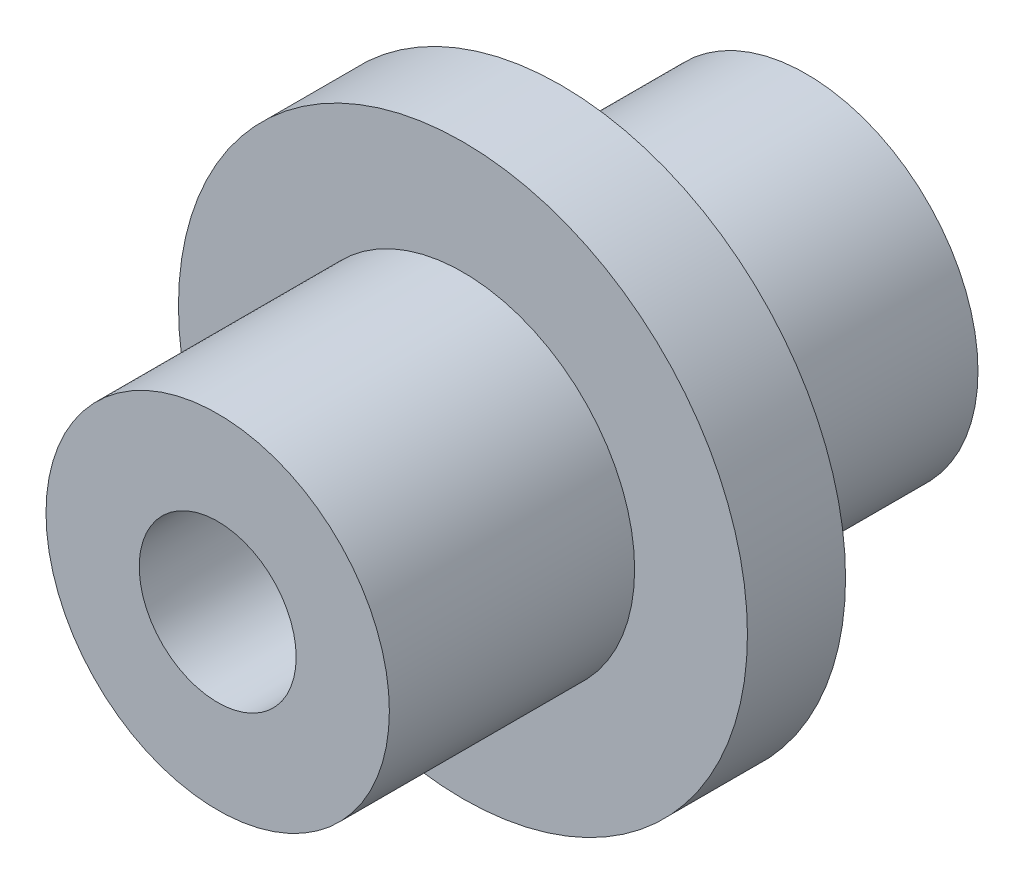
ISO-10303-21;
HEADER;
FILE_DESCRIPTION(('STEP AP214'),'2;1');
FILE_NAME('part.step','',(''),(''),'','','');
FILE_SCHEMA(('AUTOMOTIVE_DESIGN { 1 0 10303 214 1 1 1 1 }'));
ENDSEC;
DATA;
#1=APPLICATION_CONTEXT('core data for automotive mechanical design processes');
#2=APPLICATION_PROTOCOL_DEFINITION('international standard','automotive_design',2000,#1);
#3=PRODUCT_CONTEXT('',#1,'mechanical');
#4=PRODUCT('Part','Part','',(#3));
#5=PRODUCT_RELATED_PRODUCT_CATEGORY('part','',(#4));
#6=PRODUCT_DEFINITION_FORMATION('','',#4);
#7=PRODUCT_DEFINITION_CONTEXT('part definition',#1,'design');
#8=PRODUCT_DEFINITION('design','',#6,#7);
#9=PRODUCT_DEFINITION_SHAPE('','',#8);
#10=(LENGTH_UNIT() NAMED_UNIT(*) SI_UNIT(.MILLI.,.METRE.));
#11=(NAMED_UNIT(*) PLANE_ANGLE_UNIT() SI_UNIT($,.RADIAN.));
#12=(NAMED_UNIT(*) SI_UNIT($,.STERADIAN.) SOLID_ANGLE_UNIT());
#13=UNCERTAINTY_MEASURE_WITH_UNIT(LENGTH_MEASURE(1.E-05),#10,'distance_accuracy_value','');
#14=(GEOMETRIC_REPRESENTATION_CONTEXT(3) GLOBAL_UNCERTAINTY_ASSIGNED_CONTEXT((#13)) GLOBAL_UNIT_ASSIGNED_CONTEXT((#10,
#11,#12)) REPRESENTATION_CONTEXT('',''));
#15=CARTESIAN_POINT('',(0.,0.,0.));
#16=DIRECTION('',(0.,0.,1.));
#17=DIRECTION('',(1.,0.,0.));
#18=AXIS2_PLACEMENT_3D('',#15,#16,#17);
#19=CARTESIAN_POINT('',(0.,0.,31.));
#20=DIRECTION('',(0.,0.,1.));
#21=DIRECTION('',(1.,0.,0.));
#22=AXIS2_PLACEMENT_3D('',#19,#20,#21);
#23=CYLINDRICAL_SURFACE('',#22,5.8);
#24=CARTESIAN_POINT('',(0.,0.,31.));
#25=DIRECTION('',(0.,0.,1.));
#26=DIRECTION('',(1.,0.,0.));
#27=AXIS2_PLACEMENT_3D('',#24,#25,#26);
#28=CIRCLE('',#27,5.8);
#29=CARTESIAN_POINT('',(5.8,0.,31.));
#30=VERTEX_POINT('',#29);
#31=EDGE_CURVE('E44',#30,#30,#28,.T.);
#32=ORIENTED_EDGE('',*,*,#31,.T.);
#33=EDGE_LOOP('',(#32));
#34=FACE_BOUND('',#33,.T.);
#35=CARTESIAN_POINT('',(0.,0.,33.));
#36=DIRECTION('',(0.,0.,1.));
#37=DIRECTION('',(1.,0.,0.));
#38=AXIS2_PLACEMENT_3D('',#35,#36,#37);
#39=CIRCLE('',#38,5.8);
#40=CARTESIAN_POINT('',(5.8,0.,33.));
#41=VERTEX_POINT('',#40);
#42=EDGE_CURVE('E47',#41,#41,#39,.T.);
#43=ORIENTED_EDGE('',*,*,#42,.F.);
#44=EDGE_LOOP('',(#43));
#45=FACE_BOUND('',#44,.T.);
#46=ADVANCED_FACE('F39',(#34,#45),#23,.T.);
#47=CARTESIAN_POINT('',(0.,0.,31.));
#48=DIRECTION('',(0.,0.,1.));
#49=DIRECTION('',(1.,0.,0.));
#50=AXIS2_PLACEMENT_3D('',#47,#48,#49);
#51=PLANE('',#50);
#52=CARTESIAN_POINT('',(0.,0.,31.));
#53=DIRECTION('',(0.,0.,1.));
#54=DIRECTION('',(1.,0.,0.));
#55=AXIS2_PLACEMENT_3D('',#52,#53,#54);
#56=CIRCLE('',#55,3.5);
#57=CARTESIAN_POINT('',(3.5,0.,31.));
#58=VERTEX_POINT('',#57);
#59=EDGE_CURVE('E53',#58,#58,#56,.T.);
#60=ORIENTED_EDGE('',*,*,#59,.T.);
#61=EDGE_LOOP('',(#60));
#62=FACE_BOUND('',#61,.T.);
#63=ORIENTED_EDGE('',*,*,#31,.F.);
#64=EDGE_LOOP('',(#63));
#65=FACE_BOUND('',#64,.T.);
#66=ADVANCED_FACE('F95',(#62,#65),#51,.F.);
#67=CARTESIAN_POINT('',(0.,0.,33.));
#68=DIRECTION('',(0.,0.,1.));
#69=DIRECTION('',(1.,0.,0.));
#70=AXIS2_PLACEMENT_3D('',#67,#68,#69);
#71=PLANE('',#70);
#72=CARTESIAN_POINT('',(0.,0.,33.));
#73=DIRECTION('',(0.,0.,1.));
#74=DIRECTION('',(1.,0.,0.));
#75=AXIS2_PLACEMENT_3D('',#72,#73,#74);
#76=CIRCLE('',#75,3.5);
#77=CARTESIAN_POINT('',(3.5,0.,33.));
#78=VERTEX_POINT('',#77);
#79=EDGE_CURVE('E11',#78,#78,#76,.T.);
#80=ORIENTED_EDGE('',*,*,#79,.F.);
#81=EDGE_LOOP('',(#80));
#82=FACE_BOUND('',#81,.T.);
#83=ORIENTED_EDGE('',*,*,#42,.T.);
#84=EDGE_LOOP('',(#83));
#85=FACE_BOUND('',#84,.T.);
#86=ADVANCED_FACE('F76',(#82,#85),#71,.T.);
#87=CARTESIAN_POINT('',(0.,0.,38.));
#88=DIRECTION('',(0.,0.,1.));
#89=DIRECTION('',(1.,0.,0.));
#90=AXIS2_PLACEMENT_3D('',#87,#88,#89);
#91=PLANE('',#90);
#92=CARTESIAN_POINT('',(0.,0.,38.));
#93=DIRECTION('',(0.,0.,1.));
#94=DIRECTION('',(1.,0.,0.));
#95=AXIS2_PLACEMENT_3D('',#92,#93,#94);
#96=CIRCLE('',#95,1.6);
#97=CARTESIAN_POINT('',(1.6,0.,38.));
#98=VERTEX_POINT('',#97);
#99=EDGE_CURVE('E70',#98,#98,#96,.T.);
#100=ORIENTED_EDGE('',*,*,#99,.F.);
#101=EDGE_LOOP('',(#100));
#102=FACE_BOUND('',#101,.T.);
#103=CARTESIAN_POINT('',(0.,0.,38.));
#104=DIRECTION('',(0.,0.,1.));
#105=DIRECTION('',(1.,0.,0.));
#106=AXIS2_PLACEMENT_3D('',#103,#104,#105);
#107=CIRCLE('',#106,3.5);
#108=CARTESIAN_POINT('',(3.5,0.,38.));
#109=VERTEX_POINT('',#108);
#110=EDGE_CURVE('E64',#109,#109,#107,.T.);
#111=ORIENTED_EDGE('',*,*,#110,.T.);
#112=EDGE_LOOP('',(#111));
#113=FACE_BOUND('',#112,.T.);
#114=ADVANCED_FACE('F75',(#102,#113),#91,.T.);
#115=CARTESIAN_POINT('',(0.,0.,26.));
#116=DIRECTION('',(0.,0.,1.));
#117=DIRECTION('',(1.,0.,0.));
#118=AXIS2_PLACEMENT_3D('',#115,#116,#117);
#119=CYLINDRICAL_SURFACE('',#118,3.5);
#120=ORIENTED_EDGE('',*,*,#79,.T.);
#121=EDGE_LOOP('',(#120));
#122=FACE_BOUND('',#121,.T.);
#123=ORIENTED_EDGE('',*,*,#110,.F.);
#124=EDGE_LOOP('',(#123));
#125=FACE_BOUND('',#124,.T.);
#126=ADVANCED_FACE('F80',(#122,#125),#119,.T.);
#127=CARTESIAN_POINT('',(0.,0.,26.));
#128=DIRECTION('',(0.,0.,1.));
#129=DIRECTION('',(1.,0.,0.));
#130=AXIS2_PLACEMENT_3D('',#127,#128,#129);
#131=CIRCLE('',#130,3.5);
#132=CARTESIAN_POINT('',(3.5,0.,26.));
#133=VERTEX_POINT('',#132);
#134=EDGE_CURVE('E59',#133,#133,#131,.T.);
#135=ORIENTED_EDGE('',*,*,#134,.T.);
#136=EDGE_LOOP('',(#135));
#137=FACE_BOUND('',#136,.T.);
#138=ORIENTED_EDGE('',*,*,#59,.F.);
#139=EDGE_LOOP('',(#138));
#140=FACE_BOUND('',#139,.T.);
#141=ADVANCED_FACE('F85',(#137,#140),#119,.T.);
#142=CARTESIAN_POINT('',(0.,0.,26.));
#143=DIRECTION('',(0.,0.,1.));
#144=DIRECTION('',(1.,0.,0.));
#145=AXIS2_PLACEMENT_3D('',#142,#143,#144);
#146=PLANE('',#145);
#147=CARTESIAN_POINT('',(0.,0.,26.));
#148=DIRECTION('',(0.,0.,1.));
#149=DIRECTION('',(1.,0.,0.));
#150=AXIS2_PLACEMENT_3D('',#147,#148,#149);
#151=CIRCLE('',#150,1.65);
#152=CARTESIAN_POINT('',(1.65,0.,26.));
#153=VERTEX_POINT('',#152);
#154=EDGE_CURVE('E63',#153,#153,#151,.T.);
#155=ORIENTED_EDGE('',*,*,#154,.T.);
#156=EDGE_LOOP('',(#155));
#157=FACE_BOUND('',#156,.T.);
#158=ORIENTED_EDGE('',*,*,#134,.F.);
#159=EDGE_LOOP('',(#158));
#160=FACE_BOUND('',#159,.T.);
#161=ADVANCED_FACE('F89',(#157,#160),#146,.F.);
#162=CARTESIAN_POINT('',(0.,0.,38.));
#163=DIRECTION('',(0.,0.,-1.));
#164=DIRECTION('',(-1.,0.,0.));
#165=AXIS2_PLACEMENT_3D('',#162,#163,#164);
#166=CONICAL_SURFACE('',#165,1.6,0.00416664255426353);
#167=ORIENTED_EDGE('',*,*,#99,.T.);
#168=EDGE_LOOP('',(#167));
#169=FACE_BOUND('',#168,.T.);
#170=ORIENTED_EDGE('',*,*,#154,.F.);
#171=EDGE_LOOP('',(#170));
#172=FACE_BOUND('',#171,.T.);
#173=ADVANCED_FACE('F73',(#169,#172),#166,.F.);
#174=CLOSED_SHELL('',(#46,#66,#86,#114,#126,#141,#161,#173));
#175=MANIFOLD_SOLID_BREP('B2',#174);
#176=ADVANCED_BREP_SHAPE_REPRESENTATION('',(#18,#175),#14);
#177=SHAPE_DEFINITION_REPRESENTATION(#9,#176);
ENDSEC;
END-ISO-10303-21;
